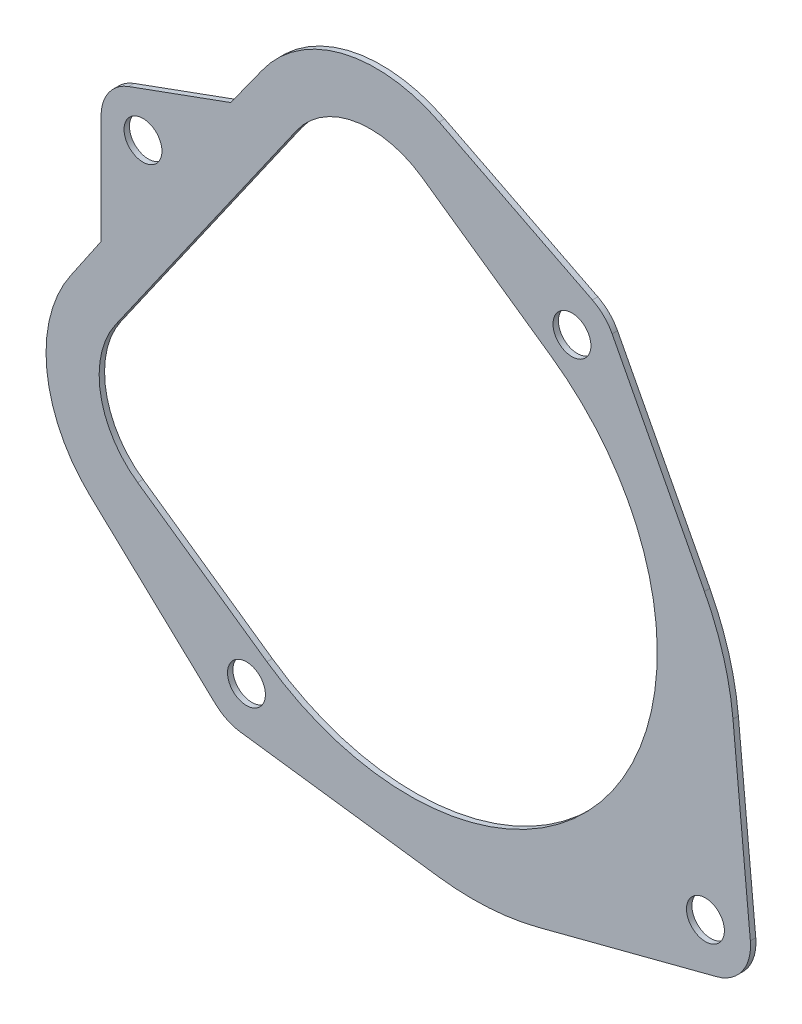
ISO-10303-21;
HEADER;
FILE_DESCRIPTION(('STEP AP214'),'2;1');
FILE_NAME('part.step','',(''),(''),'','','');
FILE_SCHEMA(('AUTOMOTIVE_DESIGN { 1 0 10303 214 1 1 1 1 }'));
ENDSEC;
DATA;
#1=APPLICATION_CONTEXT('core data for automotive mechanical design processes');
#2=APPLICATION_PROTOCOL_DEFINITION('international standard','automotive_design',2000,#1);
#3=PRODUCT_CONTEXT('',#1,'mechanical');
#4=PRODUCT('Part','Part','',(#3));
#5=PRODUCT_RELATED_PRODUCT_CATEGORY('part','',(#4));
#6=PRODUCT_DEFINITION_FORMATION('','',#4);
#7=PRODUCT_DEFINITION_CONTEXT('part definition',#1,'design');
#8=PRODUCT_DEFINITION('design','',#6,#7);
#9=PRODUCT_DEFINITION_SHAPE('','',#8);
#10=(LENGTH_UNIT() NAMED_UNIT(*) SI_UNIT(.MILLI.,.METRE.));
#11=(NAMED_UNIT(*) PLANE_ANGLE_UNIT() SI_UNIT($,.RADIAN.));
#12=(NAMED_UNIT(*) SI_UNIT($,.STERADIAN.) SOLID_ANGLE_UNIT());
#13=UNCERTAINTY_MEASURE_WITH_UNIT(LENGTH_MEASURE(1.E-05),#10,'distance_accuracy_value','');
#14=(GEOMETRIC_REPRESENTATION_CONTEXT(3) GLOBAL_UNCERTAINTY_ASSIGNED_CONTEXT((#13)) GLOBAL_UNIT_ASSIGNED_CONTEXT((#10,
#11,#12)) REPRESENTATION_CONTEXT('',''));
#15=CARTESIAN_POINT('',(0.,0.,0.));
#16=DIRECTION('',(0.,0.,1.));
#17=DIRECTION('',(1.,0.,0.));
#18=AXIS2_PLACEMENT_3D('',#15,#16,#17);
#19=CARTESIAN_POINT('',(-31.7166244267662,17.5170863542468,0.3));
#20=DIRECTION('',(0.,0.,1.));
#21=DIRECTION('',(1.,0.,0.));
#22=AXIS2_PLACEMENT_3D('',#19,#20,#21);
#23=PLANE('',#22);
#24=CARTESIAN_POINT('',(30.6376174202542,-26.1438238263883,0.3));
#25=DIRECTION('',(0.,0.,1.));
#26=DIRECTION('',(1.,0.,0.));
#27=AXIS2_PLACEMENT_3D('',#24,#25,#26);
#28=CIRCLE('',#27,2.1);
#29=CARTESIAN_POINT('',(32.7376174202542,-26.1438238263883,0.3));
#30=VERTEX_POINT('',#29);
#31=EDGE_CURVE('E249',#30,#30,#28,.T.);
#32=ORIENTED_EDGE('',*,*,#31,.F.);
#33=EDGE_LOOP('',(#32));
#34=FACE_BOUND('',#33,.T.);
#35=CARTESIAN_POINT('',(-31.7166244267662,17.5170863542468,0.3));
#36=DIRECTION('',(0.,0.,1.));
#37=DIRECTION('',(1.,0.,0.));
#38=AXIS2_PLACEMENT_3D('',#35,#36,#37);
#39=CIRCLE('',#38,2.1);
#40=CARTESIAN_POINT('',(-29.6166244267662,17.5170863542468,0.3));
#41=VERTEX_POINT('',#40);
#42=EDGE_CURVE('E261',#41,#41,#39,.T.);
#43=ORIENTED_EDGE('',*,*,#42,.F.);
#44=EDGE_LOOP('',(#43));
#45=FACE_BOUND('',#44,.T.);
#46=DIRECTION('',(0.,1.,0.));
#47=VECTOR('',#46,1.);
#48=CARTESIAN_POINT('',(-36.3667741392965,5.46993448608051,0.3));
#49=LINE('',#48,#47);
#50=CARTESIAN_POINT('',(-36.3667741392965,5.46993448608051,0.3));
#51=VERTEX_POINT('',#50);
#52=CARTESIAN_POINT('',(-36.3667741392965,17.5170863542467,0.3));
#53=VERTEX_POINT('',#52);
#54=EDGE_CURVE('E324',#51,#53,#49,.T.);
#55=ORIENTED_EDGE('',*,*,#54,.F.);
#56=DIRECTION('',(0.56326527938096,0.826276119129609,0.));
#57=VECTOR('',#56,1.);
#58=CARTESIAN_POINT('',(-39.6617252587533,0.636440352199778,0.3));
#59=LINE('',#58,#57);
#60=CARTESIAN_POINT('',(-39.6617252587533,0.636440352199778,0.3));
#61=VERTEX_POINT('',#60);
#62=EDGE_CURVE('E375',#61,#51,#59,.T.);
#63=ORIENTED_EDGE('',*,*,#62,.F.);
#64=CARTESIAN_POINT('',(-26.9631728750684,-8.25157221298087,0.3));
#65=DIRECTION('',(0.,0.,1.));
#66=DIRECTION('',(1.,0.,0.));
#67=AXIS2_PLACEMENT_3D('',#64,#65,#66);
#68=CIRCLE('',#67,15.5);
#69=CARTESIAN_POINT('',(-37.5666044594636,-19.5572008392471,0.3));
#70=VERTEX_POINT('',#69);
#71=EDGE_CURVE('E372',#61,#70,#68,.T.);
#72=ORIENTED_EDGE('',*,*,#71,.T.);
#73=DIRECTION('',(0.72939539524298,-0.684092360283563,0.));
#74=VECTOR('',#73,1.);
#75=CARTESIAN_POINT('',(-37.5666044594636,-19.5572008392471,0.3));
#76=LINE('',#75,#74);
#77=CARTESIAN_POINT('',(-23.6826581225442,-32.5788098069176,0.3));
#78=VERTEX_POINT('',#77);
#79=EDGE_CURVE('E369',#70,#78,#76,.T.);
#80=ORIENTED_EDGE('',*,*,#79,.T.);
#81=CARTESIAN_POINT('',(-20.2467719482765,-28.9153870008932,0.3));
#82=DIRECTION('',(0.,0.,-1.));
#83=DIRECTION('',(-1.,0.,0.));
#84=AXIS2_PLACEMENT_3D('',#81,#82,#83);
#85=CIRCLE('',#84,5.02254720816271);
#86=CARTESIAN_POINT('',(-20.907521199013,-33.8942815454557,0.3));
#87=VERTEX_POINT('',#86);
#88=EDGE_CURVE('E366',#87,#78,#85,.T.);
#89=ORIENTED_EDGE('',*,*,#88,.F.);
#90=DIRECTION('',(0.991308660368734,-0.13155660332323,0.));
#91=VECTOR('',#90,1.);
#92=CARTESIAN_POINT('',(-20.907521199013,-33.8942815454557,0.3));
#93=LINE('',#92,#91);
#94=CARTESIAN_POINT('',(1.02816442678642,-36.8053670709498,0.3));
#95=VERTEX_POINT('',#94);
#96=EDGE_CURVE('E363',#87,#95,#93,.T.);
#97=ORIENTED_EDGE('',*,*,#96,.T.);
#98=CARTESIAN_POINT('',(4.84330592316009,-8.05741592025652,0.3));
#99=DIRECTION('',(0.,0.,1.));
#100=DIRECTION('',(1.,0.,0.));
#101=AXIS2_PLACEMENT_3D('',#98,#99,#100);
#102=CIRCLE('',#101,29.);
#103=CARTESIAN_POINT('',(12.1473504856745,-36.1225354287996,0.3));
#104=VERTEX_POINT('',#103);
#105=EDGE_CURVE('E360',#95,#104,#102,.T.);
#106=ORIENTED_EDGE('',*,*,#105,.T.);
#107=DIRECTION('',(-0.967762741673898,-0.251863605603945,0.));
#108=VECTOR('',#107,1.);
#109=CARTESIAN_POINT('',(31.8969354482739,-30.9826375347578,0.3));
#110=LINE('',#109,#108);
#111=CARTESIAN_POINT('',(31.8969354482739,-30.9826375347578,0.3));
#112=VERTEX_POINT('',#111);
#113=EDGE_CURVE('E357',#112,#104,#110,.T.);
#114=ORIENTED_EDGE('',*,*,#113,.F.);
#115=CARTESIAN_POINT('',(30.6376174202542,-26.1438238263883,0.3));
#116=DIRECTION('',(0.,0.,-1.));
#117=DIRECTION('',(-1.,0.,0.));
#118=AXIS2_PLACEMENT_3D('',#115,#116,#117);
#119=CIRCLE('',#118,4.99999999999999);
#120=CARTESIAN_POINT('',(35.6153270878026,-25.6722239264784,0.3));
#121=VERTEX_POINT('',#120);
#122=EDGE_CURVE('E354',#121,#112,#119,.T.);
#123=ORIENTED_EDGE('',*,*,#122,.F.);
#124=DIRECTION('',(-0.0943199799819878,0.995541933509683,0.));
#125=VECTOR('',#124,1.);
#126=CARTESIAN_POINT('',(35.6153270878026,-25.6722239264784,0.3));
#127=LINE('',#126,#125);
#128=CARTESIAN_POINT('',(33.690495330896,-5.35573605913996,0.3));
#129=VERTEX_POINT('',#128);
#130=EDGE_CURVE('E351',#121,#129,#127,.T.);
#131=ORIENTED_EDGE('',*,*,#130,.T.);
#132=CARTESIAN_POINT('',(4.81977925911516,-8.09101547861758,0.3));
#133=DIRECTION('',(0.,0.,-1.));
#134=DIRECTION('',(-1.,0.,0.));
#135=AXIS2_PLACEMENT_3D('',#132,#133,#134);
#136=CIRCLE('',#135,29.);
#137=CARTESIAN_POINT('',(30.529161576738,5.32642320565825,0.3));
#138=VERTEX_POINT('',#137);
#139=EDGE_CURVE('E348',#138,#129,#136,.T.);
#140=ORIENTED_EDGE('',*,*,#139,.F.);
#141=DIRECTION('',(0.462670299457788,-0.886530424745615,0.));
#142=VECTOR('',#141,1.);
#143=CARTESIAN_POINT('',(20.2911896482718,24.9435752314387,0.3));
#144=LINE('',#143,#142);
#145=CARTESIAN_POINT('',(20.2911896482718,24.9435752314387,0.3));
#146=VERTEX_POINT('',#145);
#147=EDGE_CURVE('E345',#146,#138,#144,.T.);
#148=ORIENTED_EDGE('',*,*,#147,.F.);
#149=CARTESIAN_POINT('',(15.8385487385144,22.6197918105972,0.3));
#150=DIRECTION('',(0.,0.,1.));
#151=DIRECTION('',(1.,0.,0.));
#152=AXIS2_PLACEMENT_3D('',#149,#150,#151);
#153=CIRCLE('',#152,5.02254720816271);
#154=CARTESIAN_POINT('',(18.1058978343807,27.1014330875958,0.3));
#155=VERTEX_POINT('',#154);
#156=EDGE_CURVE('E342',#146,#155,#153,.T.);
#157=ORIENTED_EDGE('',*,*,#156,.T.);
#158=DIRECTION('',(0.892304460516565,-0.451434103432873,0.));
#159=VECTOR('',#158,1.);
#160=CARTESIAN_POINT('',(1.12099866062201,35.6944224423331,0.3));
#161=LINE('',#160,#159);
#162=CARTESIAN_POINT('',(1.12099866062201,35.6944224423331,0.3));
#163=VERTEX_POINT('',#162);
#164=EDGE_CURVE('E339',#163,#155,#161,.T.);
#165=ORIENTED_EDGE('',*,*,#164,.F.);
#166=CARTESIAN_POINT('',(-5.87622994258751,21.8637033043264,0.3));
#167=DIRECTION('',(0.,0.,-1.));
#168=DIRECTION('',(-1.,0.,0.));
#169=AXIS2_PLACEMENT_3D('',#166,#167,#168);
#170=CIRCLE('',#169,15.5);
#171=CARTESIAN_POINT('',(-18.5713904698366,30.756559942515,0.3));
#172=VERTEX_POINT('',#171);
#173=EDGE_CURVE('E336',#172,#163,#170,.T.);
#174=ORIENTED_EDGE('',*,*,#173,.F.);
#175=DIRECTION('',(-0.583797500293466,-0.811899303270486,0.));
#176=VECTOR('',#175,1.);
#177=CARTESIAN_POINT('',(-18.5713904698366,30.756559942515,0.3));
#178=LINE('',#177,#176);
#179=CARTESIAN_POINT('',(-21.9864495859286,26.0071663332775,0.3));
#180=VERTEX_POINT('',#179);
#181=EDGE_CURVE('E333',#172,#180,#178,.T.);
#182=ORIENTED_EDGE('',*,*,#181,.T.);
#183=DIRECTION('',(-0.939692620785909,-0.342020143325666,0.));
#184=VECTOR('',#183,1.);
#185=CARTESIAN_POINT('',(-21.9864495859286,26.0071663332775,0.3));
#186=LINE('',#185,#184);
#187=CARTESIAN_POINT('',(-33.3070692979316,21.8867977246612,0.3));
#188=VERTEX_POINT('',#187);
#189=EDGE_CURVE('E330',#180,#188,#186,.T.);
#190=ORIENTED_EDGE('',*,*,#189,.T.);
#191=CARTESIAN_POINT('',(-31.7166244267662,17.5170863542468,0.3));
#192=DIRECTION('',(0.,0.,1.));
#193=DIRECTION('',(1.,0.,0.));
#194=AXIS2_PLACEMENT_3D('',#191,#192,#193);
#195=CIRCLE('',#194,4.65014971253034);
#196=EDGE_CURVE('E327',#188,#53,#195,.T.);
#197=ORIENTED_EDGE('',*,*,#196,.T.);
#198=EDGE_LOOP('',(#55,#63,#72,#80,#89,#97,#106,#114,#123,#131,#140,#148,#157,#165,#174,#182,
#190,#197));
#199=FACE_BOUND('',#198,.T.);
#200=CARTESIAN_POINT('',(15.8385487385144,22.6197918105972,0.3));
#201=DIRECTION('',(0.,0.,1.));
#202=DIRECTION('',(1.,0.,0.));
#203=AXIS2_PLACEMENT_3D('',#200,#201,#202);
#204=CIRCLE('',#203,2.1);
#205=CARTESIAN_POINT('',(17.9385487385144,22.6197918105972,0.3));
#206=VERTEX_POINT('',#205);
#207=EDGE_CURVE('E267',#206,#206,#204,.T.);
#208=ORIENTED_EDGE('',*,*,#207,.F.);
#209=EDGE_LOOP('',(#208));
#210=FACE_BOUND('',#209,.T.);
#211=CARTESIAN_POINT('',(-20.2467719482765,-28.9153870008932,0.3));
#212=DIRECTION('',(0.,0.,1.));
#213=DIRECTION('',(1.,0.,0.));
#214=AXIS2_PLACEMENT_3D('',#211,#212,#213);
#215=CIRCLE('',#214,2.1);
#216=CARTESIAN_POINT('',(-18.1467719482765,-28.9153870008932,0.3));
#217=VERTEX_POINT('',#216);
#218=EDGE_CURVE('E255',#217,#217,#215,.T.);
#219=ORIENTED_EDGE('',*,*,#218,.F.);
#220=EDGE_LOOP('',(#219));
#221=FACE_BOUND('',#220,.T.);
#222=DIRECTION('',(-0.819152044288991,0.573576436351047,0.));
#223=VECTOR('',#222,1.);
#224=CARTESIAN_POINT('',(13.5692403947728,19.3788836227993,0.3));
#225=LINE('',#224,#223);
#226=CARTESIAN_POINT('',(13.5692403947728,19.3788836227993,0.3));
#227=VERTEX_POINT('',#226);
#228=CARTESIAN_POINT('',(-0.765920380284594,29.4164712589426,0.3));
#229=VERTEX_POINT('',#228);
#230=EDGE_CURVE('E226',#227,#229,#225,.T.);
#231=ORIENTED_EDGE('',*,*,#230,.F.);
#232=CARTESIAN_POINT('',(-2.20411160488103,-3.14779759514801,0.3));
#233=DIRECTION('',(0.,0.,1.));
#234=DIRECTION('',(1.,0.,0.));
#235=AXIS2_PLACEMENT_3D('',#232,#233,#234);
#236=CIRCLE('',#235,27.5);
#237=CARTESIAN_POINT('',(-17.9774636045348,-25.6744788130953,0.3));
#238=VERTEX_POINT('',#237);
#239=EDGE_CURVE('E195',#238,#227,#236,.T.);
#240=ORIENTED_EDGE('',*,*,#239,.F.);
#241=DIRECTION('',(-0.819152044288991,0.573576436351047,0.));
#242=VECTOR('',#241,1.);
#243=CARTESIAN_POINT('',(-17.9774636045348,-25.6744788130953,0.3));
#244=LINE('',#243,#242);
#245=CARTESIAN_POINT('',(-32.3126243795922,-15.6368911769519,0.3));
#246=VERTEX_POINT('',#245);
#247=EDGE_CURVE('E235',#238,#246,#244,.T.);
#248=ORIENTED_EDGE('',*,*,#247,.T.);
#249=CARTESIAN_POINT('',(-26.5768600160817,-7.44537073406204,0.3));
#250=DIRECTION('',(0.,0.,-1.));
#251=DIRECTION('',(-1.,0.,0.));
#252=AXIS2_PLACEMENT_3D('',#249,#250,#251);
#253=CIRCLE('',#252,9.99999999999999);
#254=CARTESIAN_POINT('',(-34.7683804589716,-1.70960637055157,0.3));
#255=VERTEX_POINT('',#254);
#256=EDGE_CURVE('E48',#246,#255,#253,.T.);
#257=ORIENTED_EDGE('',*,*,#256,.T.);
#258=DIRECTION('',(0.573576436351047,0.819152044288991,0.));
#259=VECTOR('',#258,1.);
#260=CARTESIAN_POINT('',(-34.7683804589716,-1.70960637055157,0.3));
#261=LINE('',#260,#259);
#262=CARTESIAN_POINT('',(-14.693205186685,26.9607151795631,0.3));
#263=VERTEX_POINT('',#262);
#264=EDGE_CURVE('E231',#255,#263,#261,.T.);
#265=ORIENTED_EDGE('',*,*,#264,.T.);
#266=CARTESIAN_POINT('',(-6.50168474379506,21.2249508160527,0.3));
#267=DIRECTION('',(0.,0.,-1.));
#268=DIRECTION('',(-1.,0.,0.));
#269=AXIS2_PLACEMENT_3D('',#266,#267,#268);
#270=CIRCLE('',#269,10.);
#271=EDGE_CURVE('E228',#263,#229,#270,.T.);
#272=ORIENTED_EDGE('',*,*,#271,.T.);
#273=EDGE_LOOP('',(#231,#240,#248,#257,#265,#272));
#274=FACE_BOUND('',#273,.T.);
#275=ADVANCED_FACE('F33',(#34,#45,#199,#210,#221,#274),#23,.T.);
#276=CARTESIAN_POINT('',(-31.7166244267662,17.5170863542468,-0.3));
#277=DIRECTION('',(0.,0.,1.));
#278=DIRECTION('',(1.,0.,0.));
#279=AXIS2_PLACEMENT_3D('',#276,#277,#278);
#280=PLANE('',#279);
#281=CARTESIAN_POINT('',(30.6376174202542,-26.1438238263883,-0.3));
#282=DIRECTION('',(0.,0.,1.));
#283=DIRECTION('',(1.,0.,0.));
#284=AXIS2_PLACEMENT_3D('',#281,#282,#283);
#285=CIRCLE('',#284,2.1);
#286=CARTESIAN_POINT('',(32.7376174202542,-26.1438238263883,-0.3));
#287=VERTEX_POINT('',#286);
#288=EDGE_CURVE('E199',#287,#287,#285,.T.);
#289=ORIENTED_EDGE('',*,*,#288,.T.);
#290=EDGE_LOOP('',(#289));
#291=FACE_BOUND('',#290,.T.);
#292=CARTESIAN_POINT('',(-31.7166244267662,17.5170863542468,-0.3));
#293=DIRECTION('',(0.,0.,1.));
#294=DIRECTION('',(1.,0.,0.));
#295=AXIS2_PLACEMENT_3D('',#292,#293,#294);
#296=CIRCLE('',#295,2.1);
#297=CARTESIAN_POINT('',(-29.6166244267662,17.5170863542468,-0.3));
#298=VERTEX_POINT('',#297);
#299=EDGE_CURVE('E258',#298,#298,#296,.T.);
#300=ORIENTED_EDGE('',*,*,#299,.T.);
#301=EDGE_LOOP('',(#300));
#302=FACE_BOUND('',#301,.T.);
#303=DIRECTION('',(0.,1.,0.));
#304=VECTOR('',#303,1.);
#305=CARTESIAN_POINT('',(-36.3667741392965,5.46993448608051,-0.3));
#306=LINE('',#305,#304);
#307=CARTESIAN_POINT('',(-36.3667741392965,5.46993448608051,-0.3));
#308=VERTEX_POINT('',#307);
#309=CARTESIAN_POINT('',(-36.3667741392965,17.5170863542467,-0.3));
#310=VERTEX_POINT('',#309);
#311=EDGE_CURVE('E270',#308,#310,#306,.T.);
#312=ORIENTED_EDGE('',*,*,#311,.T.);
#313=CARTESIAN_POINT('',(-31.7166244267662,17.5170863542468,-0.3));
#314=DIRECTION('',(0.,0.,1.));
#315=DIRECTION('',(1.,0.,0.));
#316=AXIS2_PLACEMENT_3D('',#313,#314,#315);
#317=CIRCLE('',#316,4.65014971253034);
#318=CARTESIAN_POINT('',(-33.3070692979316,21.8867977246612,-0.3));
#319=VERTEX_POINT('',#318);
#320=EDGE_CURVE('E273',#319,#310,#317,.T.);
#321=ORIENTED_EDGE('',*,*,#320,.F.);
#322=DIRECTION('',(-0.939692620785909,-0.342020143325666,0.));
#323=VECTOR('',#322,1.);
#324=CARTESIAN_POINT('',(-21.9864495859286,26.0071663332775,-0.3));
#325=LINE('',#324,#323);
#326=CARTESIAN_POINT('',(-21.9864495859286,26.0071663332775,-0.3));
#327=VERTEX_POINT('',#326);
#328=EDGE_CURVE('E276',#327,#319,#325,.T.);
#329=ORIENTED_EDGE('',*,*,#328,.F.);
#330=DIRECTION('',(-0.583797500293466,-0.811899303270486,0.));
#331=VECTOR('',#330,1.);
#332=CARTESIAN_POINT('',(-18.5713904698366,30.756559942515,-0.3));
#333=LINE('',#332,#331);
#334=CARTESIAN_POINT('',(-18.5713904698366,30.756559942515,-0.3));
#335=VERTEX_POINT('',#334);
#336=EDGE_CURVE('E279',#335,#327,#333,.T.);
#337=ORIENTED_EDGE('',*,*,#336,.F.);
#338=CARTESIAN_POINT('',(-5.87622994258751,21.8637033043264,-0.3));
#339=DIRECTION('',(0.,0.,-1.));
#340=DIRECTION('',(-1.,0.,0.));
#341=AXIS2_PLACEMENT_3D('',#338,#339,#340);
#342=CIRCLE('',#341,15.5);
#343=CARTESIAN_POINT('',(1.12099866062201,35.6944224423331,-0.3));
#344=VERTEX_POINT('',#343);
#345=EDGE_CURVE('E282',#335,#344,#342,.T.);
#346=ORIENTED_EDGE('',*,*,#345,.T.);
#347=DIRECTION('',(0.892304460516565,-0.451434103432873,0.));
#348=VECTOR('',#347,1.);
#349=CARTESIAN_POINT('',(1.12099866062201,35.6944224423331,-0.3));
#350=LINE('',#349,#348);
#351=CARTESIAN_POINT('',(18.1058978343807,27.1014330875958,-0.3));
#352=VERTEX_POINT('',#351);
#353=EDGE_CURVE('E285',#344,#352,#350,.T.);
#354=ORIENTED_EDGE('',*,*,#353,.T.);
#355=CARTESIAN_POINT('',(15.8385487385144,22.6197918105972,-0.3));
#356=DIRECTION('',(0.,0.,1.));
#357=DIRECTION('',(1.,0.,0.));
#358=AXIS2_PLACEMENT_3D('',#355,#356,#357);
#359=CIRCLE('',#358,5.02254720816271);
#360=CARTESIAN_POINT('',(20.2911896482718,24.9435752314387,-0.3));
#361=VERTEX_POINT('',#360);
#362=EDGE_CURVE('E288',#361,#352,#359,.T.);
#363=ORIENTED_EDGE('',*,*,#362,.F.);
#364=DIRECTION('',(0.462670299457788,-0.886530424745615,0.));
#365=VECTOR('',#364,1.);
#366=CARTESIAN_POINT('',(20.2911896482718,24.9435752314387,-0.3));
#367=LINE('',#366,#365);
#368=CARTESIAN_POINT('',(30.529161576738,5.32642320565825,-0.3));
#369=VERTEX_POINT('',#368);
#370=EDGE_CURVE('E291',#361,#369,#367,.T.);
#371=ORIENTED_EDGE('',*,*,#370,.T.);
#372=CARTESIAN_POINT('',(4.81977925911516,-8.09101547861758,-0.3));
#373=DIRECTION('',(0.,0.,-1.));
#374=DIRECTION('',(-1.,0.,0.));
#375=AXIS2_PLACEMENT_3D('',#372,#373,#374);
#376=CIRCLE('',#375,29.);
#377=CARTESIAN_POINT('',(33.690495330896,-5.35573605913996,-0.3));
#378=VERTEX_POINT('',#377);
#379=EDGE_CURVE('E294',#369,#378,#376,.T.);
#380=ORIENTED_EDGE('',*,*,#379,.T.);
#381=DIRECTION('',(-0.0943199799819878,0.995541933509683,0.));
#382=VECTOR('',#381,1.);
#383=CARTESIAN_POINT('',(35.6153270878026,-25.6722239264784,-0.3));
#384=LINE('',#383,#382);
#385=CARTESIAN_POINT('',(35.6153270878026,-25.6722239264784,-0.3));
#386=VERTEX_POINT('',#385);
#387=EDGE_CURVE('E297',#386,#378,#384,.T.);
#388=ORIENTED_EDGE('',*,*,#387,.F.);
#389=CARTESIAN_POINT('',(30.6376174202542,-26.1438238263883,-0.3));
#390=DIRECTION('',(0.,0.,-1.));
#391=DIRECTION('',(-1.,0.,0.));
#392=AXIS2_PLACEMENT_3D('',#389,#390,#391);
#393=CIRCLE('',#392,4.99999999999999);
#394=CARTESIAN_POINT('',(31.8969354482739,-30.9826375347578,-0.3));
#395=VERTEX_POINT('',#394);
#396=EDGE_CURVE('E300',#386,#395,#393,.T.);
#397=ORIENTED_EDGE('',*,*,#396,.T.);
#398=DIRECTION('',(-0.967762741673898,-0.251863605603945,0.));
#399=VECTOR('',#398,1.);
#400=CARTESIAN_POINT('',(31.8969354482739,-30.9826375347578,-0.3));
#401=LINE('',#400,#399);
#402=CARTESIAN_POINT('',(12.1473504856745,-36.1225354287996,-0.3));
#403=VERTEX_POINT('',#402);
#404=EDGE_CURVE('E303',#395,#403,#401,.T.);
#405=ORIENTED_EDGE('',*,*,#404,.T.);
#406=CARTESIAN_POINT('',(4.84330592316009,-8.05741592025652,-0.3));
#407=DIRECTION('',(0.,0.,1.));
#408=DIRECTION('',(1.,0.,0.));
#409=AXIS2_PLACEMENT_3D('',#406,#407,#408);
#410=CIRCLE('',#409,29.);
#411=CARTESIAN_POINT('',(1.02816442678642,-36.8053670709498,-0.3));
#412=VERTEX_POINT('',#411);
#413=EDGE_CURVE('E306',#412,#403,#410,.T.);
#414=ORIENTED_EDGE('',*,*,#413,.F.);
#415=DIRECTION('',(0.991308660368734,-0.13155660332323,0.));
#416=VECTOR('',#415,1.);
#417=CARTESIAN_POINT('',(-20.907521199013,-33.8942815454557,-0.3));
#418=LINE('',#417,#416);
#419=CARTESIAN_POINT('',(-20.907521199013,-33.8942815454557,-0.3));
#420=VERTEX_POINT('',#419);
#421=EDGE_CURVE('E309',#420,#412,#418,.T.);
#422=ORIENTED_EDGE('',*,*,#421,.F.);
#423=CARTESIAN_POINT('',(-20.2467719482765,-28.9153870008932,-0.3));
#424=DIRECTION('',(0.,0.,-1.));
#425=DIRECTION('',(-1.,0.,0.));
#426=AXIS2_PLACEMENT_3D('',#423,#424,#425);
#427=CIRCLE('',#426,5.02254720816271);
#428=CARTESIAN_POINT('',(-23.6826581225442,-32.5788098069176,-0.3));
#429=VERTEX_POINT('',#428);
#430=EDGE_CURVE('E312',#420,#429,#427,.T.);
#431=ORIENTED_EDGE('',*,*,#430,.T.);
#432=DIRECTION('',(0.72939539524298,-0.684092360283563,0.));
#433=VECTOR('',#432,1.);
#434=CARTESIAN_POINT('',(-37.5666044594636,-19.5572008392471,-0.3));
#435=LINE('',#434,#433);
#436=CARTESIAN_POINT('',(-37.5666044594636,-19.5572008392471,-0.3));
#437=VERTEX_POINT('',#436);
#438=EDGE_CURVE('E315',#437,#429,#435,.T.);
#439=ORIENTED_EDGE('',*,*,#438,.F.);
#440=CARTESIAN_POINT('',(-26.9631728750684,-8.25157221298087,-0.3));
#441=DIRECTION('',(0.,0.,1.));
#442=DIRECTION('',(1.,0.,0.));
#443=AXIS2_PLACEMENT_3D('',#440,#441,#442);
#444=CIRCLE('',#443,15.5);
#445=CARTESIAN_POINT('',(-39.6617252587533,0.636440352199778,-0.3));
#446=VERTEX_POINT('',#445);
#447=EDGE_CURVE('E318',#446,#437,#444,.T.);
#448=ORIENTED_EDGE('',*,*,#447,.F.);
#449=DIRECTION('',(0.56326527938096,0.826276119129609,0.));
#450=VECTOR('',#449,1.);
#451=CARTESIAN_POINT('',(-39.6617252587533,0.636440352199778,-0.3));
#452=LINE('',#451,#450);
#453=EDGE_CURVE('E321',#446,#308,#452,.T.);
#454=ORIENTED_EDGE('',*,*,#453,.T.);
#455=EDGE_LOOP('',(#312,#321,#329,#337,#346,#354,#363,#371,#380,#388,#397,#405,#414,#422,#431,
#439,#448,#454));
#456=FACE_BOUND('',#455,.T.);
#457=CARTESIAN_POINT('',(15.8385487385144,22.6197918105972,-0.3));
#458=DIRECTION('',(0.,0.,1.));
#459=DIRECTION('',(1.,0.,0.));
#460=AXIS2_PLACEMENT_3D('',#457,#458,#459);
#461=CIRCLE('',#460,2.1);
#462=CARTESIAN_POINT('',(17.9385487385144,22.6197918105972,-0.3));
#463=VERTEX_POINT('',#462);
#464=EDGE_CURVE('E264',#463,#463,#461,.T.);
#465=ORIENTED_EDGE('',*,*,#464,.T.);
#466=EDGE_LOOP('',(#465));
#467=FACE_BOUND('',#466,.T.);
#468=CARTESIAN_POINT('',(-20.2467719482765,-28.9153870008932,-0.3));
#469=DIRECTION('',(0.,0.,1.));
#470=DIRECTION('',(1.,0.,0.));
#471=AXIS2_PLACEMENT_3D('',#468,#469,#470);
#472=CIRCLE('',#471,2.1);
#473=CARTESIAN_POINT('',(-18.1467719482765,-28.9153870008932,-0.3));
#474=VERTEX_POINT('',#473);
#475=EDGE_CURVE('E252',#474,#474,#472,.T.);
#476=ORIENTED_EDGE('',*,*,#475,.T.);
#477=EDGE_LOOP('',(#476));
#478=FACE_BOUND('',#477,.T.);
#479=CARTESIAN_POINT('',(-2.20411160488103,-3.14779759514801,-0.3));
#480=DIRECTION('',(0.,0.,1.));
#481=DIRECTION('',(1.,0.,0.));
#482=AXIS2_PLACEMENT_3D('',#479,#480,#481);
#483=CIRCLE('',#482,27.5);
#484=CARTESIAN_POINT('',(-17.9774636045348,-25.6744788130953,-0.3));
#485=VERTEX_POINT('',#484);
#486=CARTESIAN_POINT('',(13.5692403947728,19.3788836227993,-0.3));
#487=VERTEX_POINT('',#486);
#488=EDGE_CURVE('E56',#485,#487,#483,.T.);
#489=ORIENTED_EDGE('',*,*,#488,.T.);
#490=DIRECTION('',(-0.819152044288991,0.573576436351047,0.));
#491=VECTOR('',#490,1.);
#492=CARTESIAN_POINT('',(13.5692403947728,19.3788836227993,-0.3));
#493=LINE('',#492,#491);
#494=CARTESIAN_POINT('',(-0.765920380284594,29.4164712589426,-0.3));
#495=VERTEX_POINT('',#494);
#496=EDGE_CURVE('E203',#487,#495,#493,.T.);
#497=ORIENTED_EDGE('',*,*,#496,.T.);
#498=CARTESIAN_POINT('',(-6.50168474379506,21.2249508160527,-0.3));
#499=DIRECTION('',(0.,0.,-1.));
#500=DIRECTION('',(-1.,0.,0.));
#501=AXIS2_PLACEMENT_3D('',#498,#499,#500);
#502=CIRCLE('',#501,10.);
#503=CARTESIAN_POINT('',(-14.693205186685,26.9607151795631,-0.3));
#504=VERTEX_POINT('',#503);
#505=EDGE_CURVE('E208',#504,#495,#502,.T.);
#506=ORIENTED_EDGE('',*,*,#505,.F.);
#507=DIRECTION('',(0.573576436351047,0.819152044288991,0.));
#508=VECTOR('',#507,1.);
#509=CARTESIAN_POINT('',(-34.7683804589716,-1.70960637055157,-0.3));
#510=LINE('',#509,#508);
#511=CARTESIAN_POINT('',(-34.7683804589716,-1.70960637055157,-0.3));
#512=VERTEX_POINT('',#511);
#513=EDGE_CURVE('E218',#512,#504,#510,.T.);
#514=ORIENTED_EDGE('',*,*,#513,.F.);
#515=CARTESIAN_POINT('',(-26.5768600160817,-7.44537073406204,-0.3));
#516=DIRECTION('',(0.,0.,-1.));
#517=DIRECTION('',(-1.,0.,0.));
#518=AXIS2_PLACEMENT_3D('',#515,#516,#517);
#519=CIRCLE('',#518,9.99999999999999);
#520=CARTESIAN_POINT('',(-32.3126243795922,-15.6368911769519,-0.3));
#521=VERTEX_POINT('',#520);
#522=EDGE_CURVE('E221',#521,#512,#519,.T.);
#523=ORIENTED_EDGE('',*,*,#522,.F.);
#524=DIRECTION('',(-0.819152044288991,0.573576436351047,0.));
#525=VECTOR('',#524,1.);
#526=CARTESIAN_POINT('',(-17.9774636045348,-25.6744788130953,-0.3));
#527=LINE('',#526,#525);
#528=EDGE_CURVE('E214',#485,#521,#527,.T.);
#529=ORIENTED_EDGE('',*,*,#528,.F.);
#530=EDGE_LOOP('',(#489,#497,#506,#514,#523,#529));
#531=FACE_BOUND('',#530,.T.);
#532=ADVANCED_FACE('F211',(#291,#302,#456,#467,#478,#531),#280,.F.);
#533=CARTESIAN_POINT('',(-36.3667741392965,5.46993448608051,0.3));
#534=DIRECTION('',(-1.,0.,0.));
#535=DIRECTION('',(0.,-1.,0.));
#536=AXIS2_PLACEMENT_3D('',#533,#534,#535);
#537=PLANE('',#536);
#538=DIRECTION('',(0.,0.,-1.));
#539=VECTOR('',#538,1.);
#540=CARTESIAN_POINT('',(-36.3667741392965,5.46993448608051,0.3));
#541=LINE('',#540,#539);
#542=EDGE_CURVE('E11',#51,#308,#541,.T.);
#543=ORIENTED_EDGE('',*,*,#542,.F.);
#544=ORIENTED_EDGE('',*,*,#54,.T.);
#545=DIRECTION('',(0.,0.,-1.));
#546=VECTOR('',#545,1.);
#547=CARTESIAN_POINT('',(-36.3667741392965,17.5170863542467,0.3));
#548=LINE('',#547,#546);
#549=EDGE_CURVE('E378',#53,#310,#548,.T.);
#550=ORIENTED_EDGE('',*,*,#549,.T.);
#551=ORIENTED_EDGE('',*,*,#311,.F.);
#552=EDGE_LOOP('',(#543,#544,#550,#551));
#553=FACE_BOUND('',#552,.T.);
#554=ADVANCED_FACE('F422',(#553),#537,.T.);
#555=CARTESIAN_POINT('',(-39.6617252587533,0.636440352199778,0.3));
#556=DIRECTION('',(-0.826276119129609,0.56326527938096,0.));
#557=DIRECTION('',(-0.56326527938096,-0.82627611912961,0.));
#558=AXIS2_PLACEMENT_3D('',#555,#556,#557);
#559=PLANE('',#558);
#560=DIRECTION('',(0.,0.,-1.));
#561=VECTOR('',#560,1.);
#562=CARTESIAN_POINT('',(-39.6617252587533,0.636440352199778,0.3));
#563=LINE('',#562,#561);
#564=EDGE_CURVE('E41',#61,#446,#563,.T.);
#565=ORIENTED_EDGE('',*,*,#564,.F.);
#566=ORIENTED_EDGE('',*,*,#62,.T.);
#567=ORIENTED_EDGE('',*,*,#542,.T.);
#568=ORIENTED_EDGE('',*,*,#453,.F.);
#569=EDGE_LOOP('',(#565,#566,#567,#568));
#570=FACE_BOUND('',#569,.T.);
#571=ADVANCED_FACE('F35',(#570),#559,.T.);
#572=CARTESIAN_POINT('',(-26.9631728750684,-8.25157221298087,0.3));
#573=DIRECTION('',(0.,0.,-1.));
#574=DIRECTION('',(-1.,0.,0.));
#575=AXIS2_PLACEMENT_3D('',#572,#573,#574);
#576=CYLINDRICAL_SURFACE('',#575,15.5);
#577=DIRECTION('',(0.,0.,-1.));
#578=VECTOR('',#577,1.);
#579=CARTESIAN_POINT('',(-37.5666044594636,-19.5572008392471,0.3));
#580=LINE('',#579,#578);
#581=EDGE_CURVE('E408',#70,#437,#580,.T.);
#582=ORIENTED_EDGE('',*,*,#581,.F.);
#583=ORIENTED_EDGE('',*,*,#71,.F.);
#584=ORIENTED_EDGE('',*,*,#564,.T.);
#585=ORIENTED_EDGE('',*,*,#447,.T.);
#586=EDGE_LOOP('',(#582,#583,#584,#585));
#587=FACE_BOUND('',#586,.T.);
#588=ADVANCED_FACE('F412',(#587),#576,.T.);
#589=CARTESIAN_POINT('',(-37.5666044594636,-19.5572008392471,0.3));
#590=DIRECTION('',(0.684092360283563,0.72939539524298,0.));
#591=DIRECTION('',(-0.72939539524298,0.684092360283563,0.));
#592=AXIS2_PLACEMENT_3D('',#589,#590,#591);
#593=PLANE('',#592);
#594=DIRECTION('',(0.,0.,-1.));
#595=VECTOR('',#594,1.);
#596=CARTESIAN_POINT('',(-23.6826581225442,-32.5788098069176,0.3));
#597=LINE('',#596,#595);
#598=EDGE_CURVE('E406',#78,#429,#597,.T.);
#599=ORIENTED_EDGE('',*,*,#598,.F.);
#600=ORIENTED_EDGE('',*,*,#79,.F.);
#601=ORIENTED_EDGE('',*,*,#581,.T.);
#602=ORIENTED_EDGE('',*,*,#438,.T.);
#603=EDGE_LOOP('',(#599,#600,#601,#602));
#604=FACE_BOUND('',#603,.T.);
#605=ADVANCED_FACE('F480',(#604),#593,.F.);
#606=CARTESIAN_POINT('',(-20.2467719482765,-28.9153870008932,0.3));
#607=DIRECTION('',(0.,0.,-1.));
#608=DIRECTION('',(-1.,0.,0.));
#609=AXIS2_PLACEMENT_3D('',#606,#607,#608);
#610=CYLINDRICAL_SURFACE('',#609,5.02254720816271);
#611=DIRECTION('',(0.,0.,-1.));
#612=VECTOR('',#611,1.);
#613=CARTESIAN_POINT('',(-20.907521199013,-33.8942815454557,0.3));
#614=LINE('',#613,#612);
#615=EDGE_CURVE('E404',#87,#420,#614,.T.);
#616=ORIENTED_EDGE('',*,*,#615,.F.);
#617=ORIENTED_EDGE('',*,*,#88,.T.);
#618=ORIENTED_EDGE('',*,*,#598,.T.);
#619=ORIENTED_EDGE('',*,*,#430,.F.);
#620=EDGE_LOOP('',(#616,#617,#618,#619));
#621=FACE_BOUND('',#620,.T.);
#622=ADVANCED_FACE('F478',(#621),#610,.T.);
#623=CARTESIAN_POINT('',(-20.907521199013,-33.8942815454557,0.3));
#624=DIRECTION('',(0.13155660332323,0.991308660368734,0.));
#625=DIRECTION('',(-0.991308660368734,0.13155660332323,0.));
#626=AXIS2_PLACEMENT_3D('',#623,#624,#625);
#627=PLANE('',#626);
#628=DIRECTION('',(0.,0.,-1.));
#629=VECTOR('',#628,1.);
#630=CARTESIAN_POINT('',(1.02816442678642,-36.8053670709498,0.3));
#631=LINE('',#630,#629);
#632=EDGE_CURVE('E402',#95,#412,#631,.T.);
#633=ORIENTED_EDGE('',*,*,#632,.F.);
#634=ORIENTED_EDGE('',*,*,#96,.F.);
#635=ORIENTED_EDGE('',*,*,#615,.T.);
#636=ORIENTED_EDGE('',*,*,#421,.T.);
#637=EDGE_LOOP('',(#633,#634,#635,#636));
#638=FACE_BOUND('',#637,.T.);
#639=ADVANCED_FACE('F474',(#638),#627,.F.);
#640=CARTESIAN_POINT('',(4.84330592316009,-8.05741592025652,0.3));
#641=DIRECTION('',(0.,0.,-1.));
#642=DIRECTION('',(-1.,0.,0.));
#643=AXIS2_PLACEMENT_3D('',#640,#641,#642);
#644=CYLINDRICAL_SURFACE('',#643,29.);
#645=DIRECTION('',(0.,0.,-1.));
#646=VECTOR('',#645,1.);
#647=CARTESIAN_POINT('',(12.1473504856745,-36.1225354287996,0.3));
#648=LINE('',#647,#646);
#649=EDGE_CURVE('E400',#104,#403,#648,.T.);
#650=ORIENTED_EDGE('',*,*,#649,.F.);
#651=ORIENTED_EDGE('',*,*,#105,.F.);
#652=ORIENTED_EDGE('',*,*,#632,.T.);
#653=ORIENTED_EDGE('',*,*,#413,.T.);
#654=EDGE_LOOP('',(#650,#651,#652,#653));
#655=FACE_BOUND('',#654,.T.);
#656=ADVANCED_FACE('F470',(#655),#644,.T.);
#657=CARTESIAN_POINT('',(31.8969354482739,-30.9826375347578,0.3));
#658=DIRECTION('',(0.251863605603945,-0.967762741673898,0.));
#659=DIRECTION('',(0.967762741673898,0.251863605603945,0.));
#660=AXIS2_PLACEMENT_3D('',#657,#658,#659);
#661=PLANE('',#660);
#662=DIRECTION('',(0.,0.,-1.));
#663=VECTOR('',#662,1.);
#664=CARTESIAN_POINT('',(31.8969354482739,-30.9826375347578,0.3));
#665=LINE('',#664,#663);
#666=EDGE_CURVE('E398',#112,#395,#665,.T.);
#667=ORIENTED_EDGE('',*,*,#666,.F.);
#668=ORIENTED_EDGE('',*,*,#113,.T.);
#669=ORIENTED_EDGE('',*,*,#649,.T.);
#670=ORIENTED_EDGE('',*,*,#404,.F.);
#671=EDGE_LOOP('',(#667,#668,#669,#670));
#672=FACE_BOUND('',#671,.T.);
#673=ADVANCED_FACE('F467',(#672),#661,.T.);
#674=CARTESIAN_POINT('',(30.6376174202542,-26.1438238263883,0.3));
#675=DIRECTION('',(0.,0.,-1.));
#676=DIRECTION('',(-1.,0.,0.));
#677=AXIS2_PLACEMENT_3D('',#674,#675,#676);
#678=CYLINDRICAL_SURFACE('',#677,4.99999999999999);
#679=DIRECTION('',(0.,0.,-1.));
#680=VECTOR('',#679,1.);
#681=CARTESIAN_POINT('',(35.6153270878026,-25.6722239264784,0.3));
#682=LINE('',#681,#680);
#683=EDGE_CURVE('E396',#121,#386,#682,.T.);
#684=ORIENTED_EDGE('',*,*,#683,.F.);
#685=ORIENTED_EDGE('',*,*,#122,.T.);
#686=ORIENTED_EDGE('',*,*,#666,.T.);
#687=ORIENTED_EDGE('',*,*,#396,.F.);
#688=EDGE_LOOP('',(#684,#685,#686,#687));
#689=FACE_BOUND('',#688,.T.);
#690=ADVANCED_FACE('F462',(#689),#678,.T.);
#691=CARTESIAN_POINT('',(35.6153270878026,-25.6722239264784,0.3));
#692=DIRECTION('',(-0.995541933509683,-0.0943199799819878,0.));
#693=DIRECTION('',(0.0943199799819878,-0.995541933509683,0.));
#694=AXIS2_PLACEMENT_3D('',#691,#692,#693);
#695=PLANE('',#694);
#696=DIRECTION('',(0.,0.,-1.));
#697=VECTOR('',#696,1.);
#698=CARTESIAN_POINT('',(33.690495330896,-5.35573605913996,0.3));
#699=LINE('',#698,#697);
#700=EDGE_CURVE('E394',#129,#378,#699,.T.);
#701=ORIENTED_EDGE('',*,*,#700,.F.);
#702=ORIENTED_EDGE('',*,*,#130,.F.);
#703=ORIENTED_EDGE('',*,*,#683,.T.);
#704=ORIENTED_EDGE('',*,*,#387,.T.);
#705=EDGE_LOOP('',(#701,#702,#703,#704));
#706=FACE_BOUND('',#705,.T.);
#707=ADVANCED_FACE('F458',(#706),#695,.F.);
#708=CARTESIAN_POINT('',(4.81977925911516,-8.09101547861758,0.3));
#709=DIRECTION('',(0.,0.,-1.));
#710=DIRECTION('',(-1.,0.,0.));
#711=AXIS2_PLACEMENT_3D('',#708,#709,#710);
#712=CYLINDRICAL_SURFACE('',#711,29.);
#713=DIRECTION('',(0.,0.,-1.));
#714=VECTOR('',#713,1.);
#715=CARTESIAN_POINT('',(30.529161576738,5.32642320565825,0.3));
#716=LINE('',#715,#714);
#717=EDGE_CURVE('E392',#138,#369,#716,.T.);
#718=ORIENTED_EDGE('',*,*,#717,.F.);
#719=ORIENTED_EDGE('',*,*,#139,.T.);
#720=ORIENTED_EDGE('',*,*,#700,.T.);
#721=ORIENTED_EDGE('',*,*,#379,.F.);
#722=EDGE_LOOP('',(#718,#719,#720,#721));
#723=FACE_BOUND('',#722,.T.);
#724=ADVANCED_FACE('F454',(#723),#712,.T.);
#725=CARTESIAN_POINT('',(20.2911896482718,24.9435752314387,0.3));
#726=DIRECTION('',(0.886530424745615,0.462670299457788,0.));
#727=DIRECTION('',(-0.462670299457788,0.886530424745615,0.));
#728=AXIS2_PLACEMENT_3D('',#725,#726,#727);
#729=PLANE('',#728);
#730=DIRECTION('',(0.,0.,-1.));
#731=VECTOR('',#730,1.);
#732=CARTESIAN_POINT('',(20.2911896482718,24.9435752314387,0.3));
#733=LINE('',#732,#731);
#734=EDGE_CURVE('E390',#146,#361,#733,.T.);
#735=ORIENTED_EDGE('',*,*,#734,.F.);
#736=ORIENTED_EDGE('',*,*,#147,.T.);
#737=ORIENTED_EDGE('',*,*,#717,.T.);
#738=ORIENTED_EDGE('',*,*,#370,.F.);
#739=EDGE_LOOP('',(#735,#736,#737,#738));
#740=FACE_BOUND('',#739,.T.);
#741=ADVANCED_FACE('F451',(#740),#729,.T.);
#742=CARTESIAN_POINT('',(15.8385487385144,22.6197918105972,0.3));
#743=DIRECTION('',(0.,0.,-1.));
#744=DIRECTION('',(-1.,0.,0.));
#745=AXIS2_PLACEMENT_3D('',#742,#743,#744);
#746=CYLINDRICAL_SURFACE('',#745,5.02254720816271);
#747=DIRECTION('',(0.,0.,-1.));
#748=VECTOR('',#747,1.);
#749=CARTESIAN_POINT('',(18.1058978343807,27.1014330875958,0.3));
#750=LINE('',#749,#748);
#751=EDGE_CURVE('E388',#155,#352,#750,.T.);
#752=ORIENTED_EDGE('',*,*,#751,.F.);
#753=ORIENTED_EDGE('',*,*,#156,.F.);
#754=ORIENTED_EDGE('',*,*,#734,.T.);
#755=ORIENTED_EDGE('',*,*,#362,.T.);
#756=EDGE_LOOP('',(#752,#753,#754,#755));
#757=FACE_BOUND('',#756,.T.);
#758=ADVANCED_FACE('F446',(#757),#746,.T.);
#759=CARTESIAN_POINT('',(1.12099866062201,35.6944224423331,0.3));
#760=DIRECTION('',(0.451434103432873,0.892304460516565,0.));
#761=DIRECTION('',(-0.892304460516565,0.451434103432873,0.));
#762=AXIS2_PLACEMENT_3D('',#759,#760,#761);
#763=PLANE('',#762);
#764=DIRECTION('',(0.,0.,-1.));
#765=VECTOR('',#764,1.);
#766=CARTESIAN_POINT('',(1.12099866062201,35.6944224423331,0.3));
#767=LINE('',#766,#765);
#768=EDGE_CURVE('E386',#163,#344,#767,.T.);
#769=ORIENTED_EDGE('',*,*,#768,.F.);
#770=ORIENTED_EDGE('',*,*,#164,.T.);
#771=ORIENTED_EDGE('',*,*,#751,.T.);
#772=ORIENTED_EDGE('',*,*,#353,.F.);
#773=EDGE_LOOP('',(#769,#770,#771,#772));
#774=FACE_BOUND('',#773,.T.);
#775=ADVANCED_FACE('F443',(#774),#763,.T.);
#776=CARTESIAN_POINT('',(-5.87622994258751,21.8637033043264,0.3));
#777=DIRECTION('',(0.,0.,-1.));
#778=DIRECTION('',(-1.,0.,0.));
#779=AXIS2_PLACEMENT_3D('',#776,#777,#778);
#780=CYLINDRICAL_SURFACE('',#779,15.5);
#781=DIRECTION('',(0.,0.,-1.));
#782=VECTOR('',#781,1.);
#783=CARTESIAN_POINT('',(-18.5713904698366,30.756559942515,0.3));
#784=LINE('',#783,#782);
#785=EDGE_CURVE('E384',#172,#335,#784,.T.);
#786=ORIENTED_EDGE('',*,*,#785,.F.);
#787=ORIENTED_EDGE('',*,*,#173,.T.);
#788=ORIENTED_EDGE('',*,*,#768,.T.);
#789=ORIENTED_EDGE('',*,*,#345,.F.);
#790=EDGE_LOOP('',(#786,#787,#788,#789));
#791=FACE_BOUND('',#790,.T.);
#792=ADVANCED_FACE('F438',(#791),#780,.T.);
#793=CARTESIAN_POINT('',(-18.5713904698366,30.756559942515,0.3));
#794=DIRECTION('',(0.811899303270486,-0.583797500293466,0.));
#795=DIRECTION('',(0.583797500293467,0.811899303270486,0.));
#796=AXIS2_PLACEMENT_3D('',#793,#794,#795);
#797=PLANE('',#796);
#798=DIRECTION('',(0.,0.,-1.));
#799=VECTOR('',#798,1.);
#800=CARTESIAN_POINT('',(-21.9864495859286,26.0071663332775,0.3));
#801=LINE('',#800,#799);
#802=EDGE_CURVE('E382',#180,#327,#801,.T.);
#803=ORIENTED_EDGE('',*,*,#802,.F.);
#804=ORIENTED_EDGE('',*,*,#181,.F.);
#805=ORIENTED_EDGE('',*,*,#785,.T.);
#806=ORIENTED_EDGE('',*,*,#336,.T.);
#807=EDGE_LOOP('',(#803,#804,#805,#806));
#808=FACE_BOUND('',#807,.T.);
#809=ADVANCED_FACE('F434',(#808),#797,.F.);
#810=CARTESIAN_POINT('',(-21.9864495859286,26.0071663332775,0.3));
#811=DIRECTION('',(0.342020143325666,-0.939692620785909,0.));
#812=DIRECTION('',(0.939692620785909,0.342020143325666,0.));
#813=AXIS2_PLACEMENT_3D('',#810,#811,#812);
#814=PLANE('',#813);
#815=DIRECTION('',(0.,0.,-1.));
#816=VECTOR('',#815,1.);
#817=CARTESIAN_POINT('',(-33.3070692979316,21.8867977246612,0.3));
#818=LINE('',#817,#816);
#819=EDGE_CURVE('E380',#188,#319,#818,.T.);
#820=ORIENTED_EDGE('',*,*,#819,.F.);
#821=ORIENTED_EDGE('',*,*,#189,.F.);
#822=ORIENTED_EDGE('',*,*,#802,.T.);
#823=ORIENTED_EDGE('',*,*,#328,.T.);
#824=EDGE_LOOP('',(#820,#821,#822,#823));
#825=FACE_BOUND('',#824,.T.);
#826=ADVANCED_FACE('F430',(#825),#814,.F.);
#827=CARTESIAN_POINT('',(-31.7166244267662,17.5170863542468,0.3));
#828=DIRECTION('',(0.,0.,-1.));
#829=DIRECTION('',(-1.,0.,0.));
#830=AXIS2_PLACEMENT_3D('',#827,#828,#829);
#831=CYLINDRICAL_SURFACE('',#830,4.65014971253034);
#832=ORIENTED_EDGE('',*,*,#196,.F.);
#833=ORIENTED_EDGE('',*,*,#819,.T.);
#834=ORIENTED_EDGE('',*,*,#320,.T.);
#835=ORIENTED_EDGE('',*,*,#549,.F.);
#836=EDGE_LOOP('',(#832,#833,#834,#835));
#837=FACE_BOUND('',#836,.T.);
#838=ADVANCED_FACE('F427',(#837),#831,.T.);
#839=CARTESIAN_POINT('',(15.8385487385144,22.6197918105972,0.3));
#840=DIRECTION('',(0.,0.,-1.));
#841=DIRECTION('',(-1.,0.,0.));
#842=AXIS2_PLACEMENT_3D('',#839,#840,#841);
#843=CYLINDRICAL_SURFACE('',#842,2.1);
#844=ORIENTED_EDGE('',*,*,#207,.T.);
#845=EDGE_LOOP('',(#844));
#846=FACE_BOUND('',#845,.T.);
#847=ORIENTED_EDGE('',*,*,#464,.F.);
#848=EDGE_LOOP('',(#847));
#849=FACE_BOUND('',#848,.T.);
#850=ADVANCED_FACE('F527',(#846,#849),#843,.F.);
#851=CARTESIAN_POINT('',(-31.7166244267662,17.5170863542468,0.3));
#852=DIRECTION('',(0.,0.,-1.));
#853=DIRECTION('',(-1.,0.,0.));
#854=AXIS2_PLACEMENT_3D('',#851,#852,#853);
#855=CYLINDRICAL_SURFACE('',#854,2.1);
#856=ORIENTED_EDGE('',*,*,#42,.T.);
#857=EDGE_LOOP('',(#856));
#858=FACE_BOUND('',#857,.T.);
#859=ORIENTED_EDGE('',*,*,#299,.F.);
#860=EDGE_LOOP('',(#859));
#861=FACE_BOUND('',#860,.T.);
#862=ADVANCED_FACE('F523',(#858,#861),#855,.F.);
#863=CARTESIAN_POINT('',(-20.2467719482765,-28.9153870008932,0.3));
#864=DIRECTION('',(0.,0.,-1.));
#865=DIRECTION('',(-1.,0.,0.));
#866=AXIS2_PLACEMENT_3D('',#863,#864,#865);
#867=CYLINDRICAL_SURFACE('',#866,2.1);
#868=ORIENTED_EDGE('',*,*,#218,.T.);
#869=EDGE_LOOP('',(#868));
#870=FACE_BOUND('',#869,.T.);
#871=ORIENTED_EDGE('',*,*,#475,.F.);
#872=EDGE_LOOP('',(#871));
#873=FACE_BOUND('',#872,.T.);
#874=ADVANCED_FACE('F519',(#870,#873),#867,.F.);
#875=CARTESIAN_POINT('',(30.6376174202542,-26.1438238263883,0.3));
#876=DIRECTION('',(0.,0.,-1.));
#877=DIRECTION('',(-1.,0.,0.));
#878=AXIS2_PLACEMENT_3D('',#875,#876,#877);
#879=CYLINDRICAL_SURFACE('',#878,2.1);
#880=ORIENTED_EDGE('',*,*,#31,.T.);
#881=EDGE_LOOP('',(#880));
#882=FACE_BOUND('',#881,.T.);
#883=ORIENTED_EDGE('',*,*,#288,.F.);
#884=EDGE_LOOP('',(#883));
#885=FACE_BOUND('',#884,.T.);
#886=ADVANCED_FACE('F516',(#882,#885),#879,.F.);
#887=CARTESIAN_POINT('',(-2.20411160488103,-3.14779759514801,0.3));
#888=DIRECTION('',(0.,0.,-1.));
#889=DIRECTION('',(-1.,0.,0.));
#890=AXIS2_PLACEMENT_3D('',#887,#888,#889);
#891=CYLINDRICAL_SURFACE('',#890,27.5);
#892=DIRECTION('',(0.,0.,-1.));
#893=VECTOR('',#892,1.);
#894=CARTESIAN_POINT('',(13.5692403947728,19.3788836227993,0.3));
#895=LINE('',#894,#893);
#896=EDGE_CURVE('E191',#227,#487,#895,.T.);
#897=ORIENTED_EDGE('',*,*,#896,.T.);
#898=ORIENTED_EDGE('',*,*,#488,.F.);
#899=DIRECTION('',(0.,0.,-1.));
#900=VECTOR('',#899,1.);
#901=CARTESIAN_POINT('',(-17.9774636045348,-25.6744788130953,0.3));
#902=LINE('',#901,#900);
#903=EDGE_CURVE('E238',#238,#485,#902,.T.);
#904=ORIENTED_EDGE('',*,*,#903,.F.);
#905=ORIENTED_EDGE('',*,*,#239,.T.);
#906=EDGE_LOOP('',(#897,#898,#904,#905));
#907=FACE_BOUND('',#906,.T.);
#908=ADVANCED_FACE('F193',(#907),#891,.F.);
#909=CARTESIAN_POINT('',(13.5692403947728,19.3788836227993,0.3));
#910=DIRECTION('',(-0.573576436351047,-0.819152044288991,0.));
#911=DIRECTION('',(0.819152044288991,-0.573576436351047,0.));
#912=AXIS2_PLACEMENT_3D('',#909,#910,#911);
#913=PLANE('',#912);
#914=DIRECTION('',(0.,0.,-1.));
#915=VECTOR('',#914,1.);
#916=CARTESIAN_POINT('',(-0.765920380284594,29.4164712589426,0.3));
#917=LINE('',#916,#915);
#918=EDGE_CURVE('E200',#229,#495,#917,.T.);
#919=ORIENTED_EDGE('',*,*,#918,.T.);
#920=ORIENTED_EDGE('',*,*,#496,.F.);
#921=ORIENTED_EDGE('',*,*,#896,.F.);
#922=ORIENTED_EDGE('',*,*,#230,.T.);
#923=EDGE_LOOP('',(#919,#920,#921,#922));
#924=FACE_BOUND('',#923,.T.);
#925=ADVANCED_FACE('F204',(#924),#913,.T.);
#926=CARTESIAN_POINT('',(-6.50168474379506,21.2249508160527,0.3));
#927=DIRECTION('',(0.,0.,-1.));
#928=DIRECTION('',(-1.,0.,0.));
#929=AXIS2_PLACEMENT_3D('',#926,#927,#928);
#930=CYLINDRICAL_SURFACE('',#929,10.);
#931=DIRECTION('',(0.,0.,-1.));
#932=VECTOR('',#931,1.);
#933=CARTESIAN_POINT('',(-14.693205186685,26.9607151795631,0.3));
#934=LINE('',#933,#932);
#935=EDGE_CURVE('E244',#263,#504,#934,.T.);
#936=ORIENTED_EDGE('',*,*,#935,.T.);
#937=ORIENTED_EDGE('',*,*,#505,.T.);
#938=ORIENTED_EDGE('',*,*,#918,.F.);
#939=ORIENTED_EDGE('',*,*,#271,.F.);
#940=EDGE_LOOP('',(#936,#937,#938,#939));
#941=FACE_BOUND('',#940,.T.);
#942=ADVANCED_FACE('F494',(#941),#930,.F.);
#943=CARTESIAN_POINT('',(-34.7683804589716,-1.70960637055157,0.3));
#944=DIRECTION('',(-0.819152044288991,0.573576436351047,0.));
#945=DIRECTION('',(-0.573576436351047,-0.819152044288991,0.));
#946=AXIS2_PLACEMENT_3D('',#943,#944,#945);
#947=PLANE('',#946);
#948=DIRECTION('',(0.,0.,-1.));
#949=VECTOR('',#948,1.);
#950=CARTESIAN_POINT('',(-34.7683804589716,-1.70960637055157,0.3));
#951=LINE('',#950,#949);
#952=EDGE_CURVE('E242',#255,#512,#951,.T.);
#953=ORIENTED_EDGE('',*,*,#952,.T.);
#954=ORIENTED_EDGE('',*,*,#513,.T.);
#955=ORIENTED_EDGE('',*,*,#935,.F.);
#956=ORIENTED_EDGE('',*,*,#264,.F.);
#957=EDGE_LOOP('',(#953,#954,#955,#956));
#958=FACE_BOUND('',#957,.T.);
#959=ADVANCED_FACE('F497',(#958),#947,.F.);
#960=CARTESIAN_POINT('',(-26.5768600160817,-7.44537073406204,0.3));
#961=DIRECTION('',(0.,0.,-1.));
#962=DIRECTION('',(-1.,0.,0.));
#963=AXIS2_PLACEMENT_3D('',#960,#961,#962);
#964=CYLINDRICAL_SURFACE('',#963,9.99999999999999);
#965=DIRECTION('',(0.,0.,-1.));
#966=VECTOR('',#965,1.);
#967=CARTESIAN_POINT('',(-32.3126243795922,-15.6368911769519,0.3));
#968=LINE('',#967,#966);
#969=EDGE_CURVE('E240',#246,#521,#968,.T.);
#970=ORIENTED_EDGE('',*,*,#969,.T.);
#971=ORIENTED_EDGE('',*,*,#522,.T.);
#972=ORIENTED_EDGE('',*,*,#952,.F.);
#973=ORIENTED_EDGE('',*,*,#256,.F.);
#974=EDGE_LOOP('',(#970,#971,#972,#973));
#975=FACE_BOUND('',#974,.T.);
#976=ADVANCED_FACE('F498',(#975),#964,.F.);
#977=CARTESIAN_POINT('',(-17.9774636045348,-25.6744788130953,0.3));
#978=DIRECTION('',(-0.573576436351047,-0.819152044288991,0.));
#979=DIRECTION('',(0.819152044288991,-0.573576436351047,0.));
#980=AXIS2_PLACEMENT_3D('',#977,#978,#979);
#981=PLANE('',#980);
#982=ORIENTED_EDGE('',*,*,#247,.F.);
#983=ORIENTED_EDGE('',*,*,#903,.T.);
#984=ORIENTED_EDGE('',*,*,#528,.T.);
#985=ORIENTED_EDGE('',*,*,#969,.F.);
#986=EDGE_LOOP('',(#982,#983,#984,#985));
#987=FACE_BOUND('',#986,.T.);
#988=ADVANCED_FACE('F501',(#987),#981,.F.);
#989=CLOSED_SHELL('',(#275,#532,#554,#571,#588,#605,#622,#639,#656,#673,#690,#707,#724,#741,
#758,#775,#792,#809,#826,#838,#850,#862,#874,#886,#908,#925,#942,#959,#976,#988));
#990=MANIFOLD_SOLID_BREP('B2',#989);
#991=ADVANCED_BREP_SHAPE_REPRESENTATION('',(#18,#990),#14);
#992=SHAPE_DEFINITION_REPRESENTATION(#9,#991);
ENDSEC;
END-ISO-10303-21;
